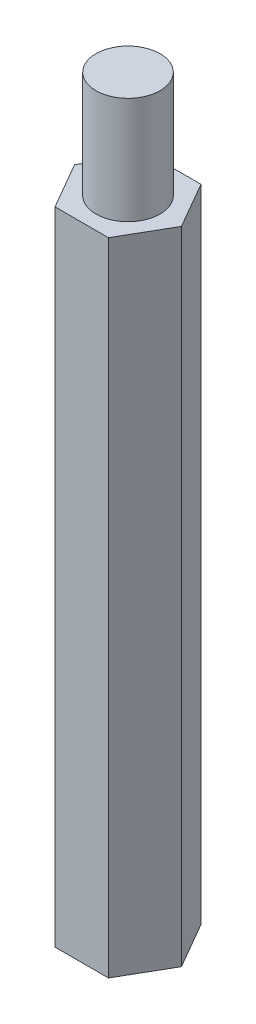
ISO-10303-21;
HEADER;
FILE_DESCRIPTION(('STEP AP214'),'2;1');
FILE_NAME('part.step','',(''),(''),'','','');
FILE_SCHEMA(('AUTOMOTIVE_DESIGN { 1 0 10303 214 1 1 1 1 }'));
ENDSEC;
DATA;
#1=APPLICATION_CONTEXT('core data for automotive mechanical design processes');
#2=APPLICATION_PROTOCOL_DEFINITION('international standard','automotive_design',2000,#1);
#3=PRODUCT_CONTEXT('',#1,'mechanical');
#4=PRODUCT('Part','Part','',(#3));
#5=PRODUCT_RELATED_PRODUCT_CATEGORY('part','',(#4));
#6=PRODUCT_DEFINITION_FORMATION('','',#4);
#7=PRODUCT_DEFINITION_CONTEXT('part definition',#1,'design');
#8=PRODUCT_DEFINITION('design','',#6,#7);
#9=PRODUCT_DEFINITION_SHAPE('','',#8);
#10=(LENGTH_UNIT() NAMED_UNIT(*) SI_UNIT(.MILLI.,.METRE.));
#11=(NAMED_UNIT(*) PLANE_ANGLE_UNIT() SI_UNIT($,.RADIAN.));
#12=(NAMED_UNIT(*) SI_UNIT($,.STERADIAN.) SOLID_ANGLE_UNIT());
#13=UNCERTAINTY_MEASURE_WITH_UNIT(LENGTH_MEASURE(1.E-05),#10,'distance_accuracy_value','');
#14=(GEOMETRIC_REPRESENTATION_CONTEXT(3) GLOBAL_UNCERTAINTY_ASSIGNED_CONTEXT((#13)) GLOBAL_UNIT_ASSIGNED_CONTEXT((#10,
#11,#12)) REPRESENTATION_CONTEXT('',''));
#15=CARTESIAN_POINT('',(0.,0.,0.));
#16=DIRECTION('',(0.,0.,1.));
#17=DIRECTION('',(1.,0.,0.));
#18=AXIS2_PLACEMENT_3D('',#15,#16,#17);
#19=CARTESIAN_POINT('',(0.,30.,0.));
#20=DIRECTION('',(0.,1.,0.));
#21=DIRECTION('',(0.,0.,1.));
#22=AXIS2_PLACEMENT_3D('',#19,#20,#21);
#23=PLANE('',#22);
#24=DIRECTION('',(1.,0.,0.));
#25=VECTOR('',#24,1.);
#26=CARTESIAN_POINT('',(-1.25,30.,2.1650635094611));
#27=LINE('',#26,#25);
#28=CARTESIAN_POINT('',(-1.25,30.,2.1650635094611));
#29=VERTEX_POINT('',#28);
#30=CARTESIAN_POINT('',(1.25,30.,2.1650635094611));
#31=VERTEX_POINT('',#30);
#32=EDGE_CURVE('E129',#29,#31,#27,.T.);
#33=ORIENTED_EDGE('',*,*,#32,.T.);
#34=DIRECTION('',(0.5,0.,-0.866025403784439));
#35=VECTOR('',#34,1.);
#36=CARTESIAN_POINT('',(1.25,30.,2.1650635094611));
#37=LINE('',#36,#35);
#38=CARTESIAN_POINT('',(2.5,30.,0.));
#39=VERTEX_POINT('',#38);
#40=EDGE_CURVE('E87',#31,#39,#37,.T.);
#41=ORIENTED_EDGE('',*,*,#40,.T.);
#42=DIRECTION('',(-0.499999999999999,0.,-0.866025403784439));
#43=VECTOR('',#42,1.);
#44=CARTESIAN_POINT('',(2.5,30.,0.));
#45=LINE('',#44,#43);
#46=CARTESIAN_POINT('',(1.25,30.,-2.1650635094611));
#47=VERTEX_POINT('',#46);
#48=EDGE_CURVE('E100',#39,#47,#45,.T.);
#49=ORIENTED_EDGE('',*,*,#48,.T.);
#50=DIRECTION('',(-1.,0.,0.));
#51=VECTOR('',#50,1.);
#52=CARTESIAN_POINT('',(1.25,30.,-2.1650635094611));
#53=LINE('',#52,#51);
#54=CARTESIAN_POINT('',(-1.25,30.,-2.1650635094611));
#55=VERTEX_POINT('',#54);
#56=EDGE_CURVE('E94',#47,#55,#53,.T.);
#57=ORIENTED_EDGE('',*,*,#56,.T.);
#58=DIRECTION('',(-0.5,0.,0.866025403784438));
#59=VECTOR('',#58,1.);
#60=CARTESIAN_POINT('',(-1.25,30.,-2.1650635094611));
#61=LINE('',#60,#59);
#62=CARTESIAN_POINT('',(-2.5,30.,0.));
#63=VERTEX_POINT('',#62);
#64=EDGE_CURVE('E98',#55,#63,#61,.T.);
#65=ORIENTED_EDGE('',*,*,#64,.T.);
#66=DIRECTION('',(0.499999999999999,0.,0.866025403784439));
#67=VECTOR('',#66,1.);
#68=CARTESIAN_POINT('',(-2.5,30.,0.));
#69=LINE('',#68,#67);
#70=EDGE_CURVE('E50',#63,#29,#69,.T.);
#71=ORIENTED_EDGE('',*,*,#70,.T.);
#72=EDGE_LOOP('',(#33,#41,#49,#57,#65,#71));
#73=FACE_BOUND('',#72,.T.);
#74=CARTESIAN_POINT('',(0.,30.,0.));
#75=DIRECTION('',(0.,1.,0.));
#76=DIRECTION('',(0.,0.,1.));
#77=AXIS2_PLACEMENT_3D('',#74,#75,#76);
#78=CIRCLE('',#77,1.5);
#79=CARTESIAN_POINT('',(0.,30.,1.5));
#80=VERTEX_POINT('',#79);
#81=EDGE_CURVE('E179',#80,#80,#78,.T.);
#82=ORIENTED_EDGE('',*,*,#81,.F.);
#83=EDGE_LOOP('',(#82));
#84=FACE_BOUND('',#83,.T.);
#85=ADVANCED_FACE('F33',(#73,#84),#23,.T.);
#86=CARTESIAN_POINT('',(-1.25,30.,2.1650635094611));
#87=DIRECTION('',(0.,0.,-1.));
#88=DIRECTION('',(-1.,0.,0.));
#89=AXIS2_PLACEMENT_3D('',#86,#87,#88);
#90=PLANE('',#89);
#91=DIRECTION('',(1.,0.,0.));
#92=VECTOR('',#91,1.);
#93=CARTESIAN_POINT('',(-1.25,0.,2.1650635094611));
#94=LINE('',#93,#92);
#95=CARTESIAN_POINT('',(-1.25,0.,2.1650635094611));
#96=VERTEX_POINT('',#95);
#97=CARTESIAN_POINT('',(1.25,0.,2.1650635094611));
#98=VERTEX_POINT('',#97);
#99=EDGE_CURVE('E118',#96,#98,#94,.T.);
#100=ORIENTED_EDGE('',*,*,#99,.T.);
#101=DIRECTION('',(0.,-1.,0.));
#102=VECTOR('',#101,1.);
#103=CARTESIAN_POINT('',(1.25,30.,2.1650635094611));
#104=LINE('',#103,#102);
#105=EDGE_CURVE('E11',#31,#98,#104,.T.);
#106=ORIENTED_EDGE('',*,*,#105,.F.);
#107=ORIENTED_EDGE('',*,*,#32,.F.);
#108=DIRECTION('',(0.,-1.,0.));
#109=VECTOR('',#108,1.);
#110=CARTESIAN_POINT('',(-1.25,30.,2.1650635094611));
#111=LINE('',#110,#109);
#112=EDGE_CURVE('E114',#29,#96,#111,.T.);
#113=ORIENTED_EDGE('',*,*,#112,.T.);
#114=EDGE_LOOP('',(#100,#106,#107,#113));
#115=FACE_BOUND('',#114,.T.);
#116=ADVANCED_FACE('F35',(#115),#90,.F.);
#117=CARTESIAN_POINT('',(1.25,30.,2.1650635094611));
#118=DIRECTION('',(-0.866025403784439,0.,-0.5));
#119=DIRECTION('',(-0.5,0.,0.866025403784439));
#120=AXIS2_PLACEMENT_3D('',#117,#118,#119);
#121=PLANE('',#120);
#122=DIRECTION('',(0.5,0.,-0.866025403784439));
#123=VECTOR('',#122,1.);
#124=CARTESIAN_POINT('',(1.25,0.,2.1650635094611));
#125=LINE('',#124,#123);
#126=CARTESIAN_POINT('',(2.5,0.,0.));
#127=VERTEX_POINT('',#126);
#128=EDGE_CURVE('E121',#98,#127,#125,.T.);
#129=ORIENTED_EDGE('',*,*,#128,.T.);
#130=DIRECTION('',(0.,-1.,0.));
#131=VECTOR('',#130,1.);
#132=CARTESIAN_POINT('',(2.5,30.,0.));
#133=LINE('',#132,#131);
#134=EDGE_CURVE('E42',#39,#127,#133,.T.);
#135=ORIENTED_EDGE('',*,*,#134,.F.);
#136=ORIENTED_EDGE('',*,*,#40,.F.);
#137=ORIENTED_EDGE('',*,*,#105,.T.);
#138=EDGE_LOOP('',(#129,#135,#136,#137));
#139=FACE_BOUND('',#138,.T.);
#140=ADVANCED_FACE('F158',(#139),#121,.F.);
#141=CARTESIAN_POINT('',(2.5,30.,0.));
#142=DIRECTION('',(-0.866025403784439,0.,0.499999999999999));
#143=DIRECTION('',(0.499999999999999,0.,0.866025403784439));
#144=AXIS2_PLACEMENT_3D('',#141,#142,#143);
#145=PLANE('',#144);
#146=DIRECTION('',(-0.499999999999999,0.,-0.866025403784439));
#147=VECTOR('',#146,1.);
#148=CARTESIAN_POINT('',(2.5,0.,0.));
#149=LINE('',#148,#147);
#150=CARTESIAN_POINT('',(1.25,0.,-2.1650635094611));
#151=VERTEX_POINT('',#150);
#152=EDGE_CURVE('E124',#127,#151,#149,.T.);
#153=ORIENTED_EDGE('',*,*,#152,.T.);
#154=DIRECTION('',(0.,-1.,0.));
#155=VECTOR('',#154,1.);
#156=CARTESIAN_POINT('',(1.25,30.,-2.1650635094611));
#157=LINE('',#156,#155);
#158=EDGE_CURVE('E109',#47,#151,#157,.T.);
#159=ORIENTED_EDGE('',*,*,#158,.F.);
#160=ORIENTED_EDGE('',*,*,#48,.F.);
#161=ORIENTED_EDGE('',*,*,#134,.T.);
#162=EDGE_LOOP('',(#153,#159,#160,#161));
#163=FACE_BOUND('',#162,.T.);
#164=ADVANCED_FACE('F135',(#163),#145,.F.);
#165=CARTESIAN_POINT('',(1.25,30.,-2.1650635094611));
#166=DIRECTION('',(0.,0.,1.));
#167=DIRECTION('',(1.,0.,0.));
#168=AXIS2_PLACEMENT_3D('',#165,#166,#167);
#169=PLANE('',#168);
#170=DIRECTION('',(-1.,0.,0.));
#171=VECTOR('',#170,1.);
#172=CARTESIAN_POINT('',(1.25,0.,-2.1650635094611));
#173=LINE('',#172,#171);
#174=CARTESIAN_POINT('',(-1.25,0.,-2.1650635094611));
#175=VERTEX_POINT('',#174);
#176=EDGE_CURVE('E108',#151,#175,#173,.T.);
#177=ORIENTED_EDGE('',*,*,#176,.T.);
#178=DIRECTION('',(0.,-1.,0.));
#179=VECTOR('',#178,1.);
#180=CARTESIAN_POINT('',(-1.25,30.,-2.1650635094611));
#181=LINE('',#180,#179);
#182=EDGE_CURVE('E105',#55,#175,#181,.T.);
#183=ORIENTED_EDGE('',*,*,#182,.F.);
#184=ORIENTED_EDGE('',*,*,#56,.F.);
#185=ORIENTED_EDGE('',*,*,#158,.T.);
#186=EDGE_LOOP('',(#177,#183,#184,#185));
#187=FACE_BOUND('',#186,.T.);
#188=ADVANCED_FACE('F106',(#187),#169,.F.);
#189=CARTESIAN_POINT('',(-1.25,30.,-2.1650635094611));
#190=DIRECTION('',(0.866025403784438,0.,0.5));
#191=DIRECTION('',(0.500000000000001,0.,-0.866025403784438));
#192=AXIS2_PLACEMENT_3D('',#189,#190,#191);
#193=PLANE('',#192);
#194=DIRECTION('',(-0.5,0.,0.866025403784438));
#195=VECTOR('',#194,1.);
#196=CARTESIAN_POINT('',(-1.25,0.,-2.1650635094611));
#197=LINE('',#196,#195);
#198=CARTESIAN_POINT('',(-2.5,0.,0.));
#199=VERTEX_POINT('',#198);
#200=EDGE_CURVE('E73',#175,#199,#197,.T.);
#201=ORIENTED_EDGE('',*,*,#200,.T.);
#202=DIRECTION('',(0.,-1.,0.));
#203=VECTOR('',#202,1.);
#204=CARTESIAN_POINT('',(-2.5,30.,0.));
#205=LINE('',#204,#203);
#206=EDGE_CURVE('E110',#63,#199,#205,.T.);
#207=ORIENTED_EDGE('',*,*,#206,.F.);
#208=ORIENTED_EDGE('',*,*,#64,.F.);
#209=ORIENTED_EDGE('',*,*,#182,.T.);
#210=EDGE_LOOP('',(#201,#207,#208,#209));
#211=FACE_BOUND('',#210,.T.);
#212=ADVANCED_FACE('F112',(#211),#193,.F.);
#213=CARTESIAN_POINT('',(-2.5,30.,0.));
#214=DIRECTION('',(0.866025403784439,0.,-0.499999999999999));
#215=DIRECTION('',(-0.5,0.,-0.866025403784439));
#216=AXIS2_PLACEMENT_3D('',#213,#214,#215);
#217=PLANE('',#216);
#218=DIRECTION('',(0.499999999999999,0.,0.866025403784439));
#219=VECTOR('',#218,1.);
#220=CARTESIAN_POINT('',(-2.5,0.,0.));
#221=LINE('',#220,#219);
#222=EDGE_CURVE('E79',#199,#96,#221,.T.);
#223=ORIENTED_EDGE('',*,*,#222,.T.);
#224=ORIENTED_EDGE('',*,*,#112,.F.);
#225=ORIENTED_EDGE('',*,*,#70,.F.);
#226=ORIENTED_EDGE('',*,*,#206,.T.);
#227=EDGE_LOOP('',(#223,#224,#225,#226));
#228=FACE_BOUND('',#227,.T.);
#229=ADVANCED_FACE('F142',(#228),#217,.F.);
#230=CARTESIAN_POINT('',(0.,0.,0.));
#231=DIRECTION('',(0.,1.,0.));
#232=DIRECTION('',(0.,0.,1.));
#233=AXIS2_PLACEMENT_3D('',#230,#231,#232);
#234=PLANE('',#233);
#235=CARTESIAN_POINT('',(0.,0.,0.));
#236=DIRECTION('',(0.,-1.,0.));
#237=DIRECTION('',(0.,0.,-1.));
#238=AXIS2_PLACEMENT_3D('',#235,#236,#237);
#239=CIRCLE('',#238,1.5);
#240=CARTESIAN_POINT('',(0.,0.,-1.5));
#241=VERTEX_POINT('',#240);
#242=EDGE_CURVE('E180',#241,#241,#239,.T.);
#243=ORIENTED_EDGE('',*,*,#242,.F.);
#244=EDGE_LOOP('',(#243));
#245=FACE_BOUND('',#244,.T.);
#246=ORIENTED_EDGE('',*,*,#99,.F.);
#247=ORIENTED_EDGE('',*,*,#222,.F.);
#248=ORIENTED_EDGE('',*,*,#200,.F.);
#249=ORIENTED_EDGE('',*,*,#176,.F.);
#250=ORIENTED_EDGE('',*,*,#152,.F.);
#251=ORIENTED_EDGE('',*,*,#128,.F.);
#252=EDGE_LOOP('',(#246,#247,#248,#249,#250,#251));
#253=FACE_BOUND('',#252,.T.);
#254=ADVANCED_FACE('F138',(#245,#253),#234,.F.);
#255=CARTESIAN_POINT('',(0.,35.,0.));
#256=DIRECTION('',(0.,-1.,0.));
#257=DIRECTION('',(0.,0.,-1.));
#258=AXIS2_PLACEMENT_3D('',#255,#256,#257);
#259=CYLINDRICAL_SURFACE('',#258,1.5);
#260=CARTESIAN_POINT('',(0.,35.,0.));
#261=DIRECTION('',(0.,1.,0.));
#262=DIRECTION('',(0.,0.,1.));
#263=AXIS2_PLACEMENT_3D('',#260,#261,#262);
#264=CIRCLE('',#263,1.5);
#265=CARTESIAN_POINT('',(0.,35.,1.5));
#266=VERTEX_POINT('',#265);
#267=EDGE_CURVE('E122',#266,#266,#264,.T.);
#268=ORIENTED_EDGE('',*,*,#267,.F.);
#269=EDGE_LOOP('',(#268));
#270=FACE_BOUND('',#269,.T.);
#271=ORIENTED_EDGE('',*,*,#81,.T.);
#272=EDGE_LOOP('',(#271));
#273=FACE_BOUND('',#272,.T.);
#274=ADVANCED_FACE('F149',(#270,#273),#259,.T.);
#275=CARTESIAN_POINT('',(0.,35.,0.));
#276=DIRECTION('',(0.,1.,0.));
#277=DIRECTION('',(0.,0.,1.));
#278=AXIS2_PLACEMENT_3D('',#275,#276,#277);
#279=PLANE('',#278);
#280=ORIENTED_EDGE('',*,*,#267,.T.);
#281=EDGE_LOOP('',(#280));
#282=FACE_BOUND('',#281,.T.);
#283=ADVANCED_FACE('F162',(#282),#279,.T.);
#284=CARTESIAN_POINT('',(0.,10.,0.));
#285=DIRECTION('',(0.,-1.,0.));
#286=DIRECTION('',(0.,0.,-1.));
#287=AXIS2_PLACEMENT_3D('',#284,#285,#286);
#288=CYLINDRICAL_SURFACE('',#287,1.5);
#289=CARTESIAN_POINT('',(0.,10.,0.));
#290=DIRECTION('',(0.,-1.,0.));
#291=DIRECTION('',(0.,0.,-1.));
#292=AXIS2_PLACEMENT_3D('',#289,#290,#291);
#293=CIRCLE('',#292,1.5);
#294=CARTESIAN_POINT('',(0.,10.,-1.5));
#295=VERTEX_POINT('',#294);
#296=EDGE_CURVE('E178',#295,#295,#293,.T.);
#297=ORIENTED_EDGE('',*,*,#296,.F.);
#298=EDGE_LOOP('',(#297));
#299=FACE_BOUND('',#298,.T.);
#300=ORIENTED_EDGE('',*,*,#242,.T.);
#301=EDGE_LOOP('',(#300));
#302=FACE_BOUND('',#301,.T.);
#303=ADVANCED_FACE('F166',(#299,#302),#288,.F.);
#304=CARTESIAN_POINT('',(0.,10.,0.));
#305=DIRECTION('',(0.,-1.,0.));
#306=DIRECTION('',(0.,0.,-1.));
#307=AXIS2_PLACEMENT_3D('',#304,#305,#306);
#308=PLANE('',#307);
#309=ORIENTED_EDGE('',*,*,#296,.T.);
#310=EDGE_LOOP('',(#309));
#311=FACE_BOUND('',#310,.T.);
#312=ADVANCED_FACE('F170',(#311),#308,.T.);
#313=CLOSED_SHELL('',(#85,#116,#140,#164,#188,#212,#229,#254,#274,#283,#303,#312));
#314=MANIFOLD_SOLID_BREP('B2',#313);
#315=ADVANCED_BREP_SHAPE_REPRESENTATION('',(#18,#314),#14);
#316=SHAPE_DEFINITION_REPRESENTATION(#9,#315);
ENDSEC;
END-ISO-10303-21;
